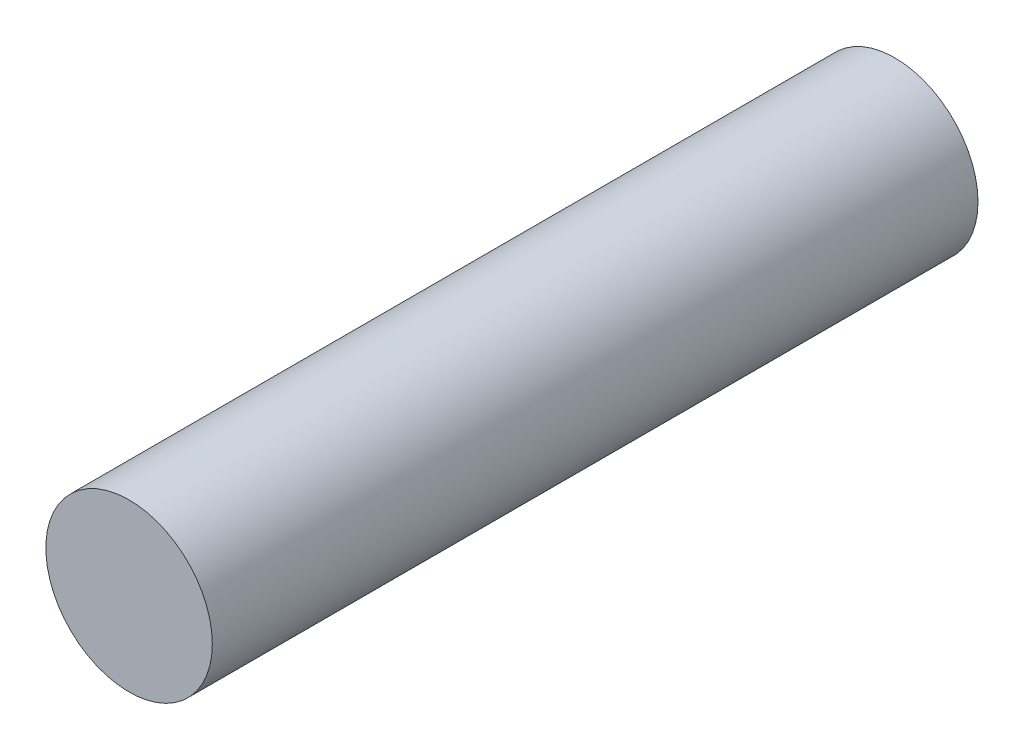
ISO-10303-21;
HEADER;
FILE_DESCRIPTION(('STEP AP214'),'2;1');
FILE_NAME('part.step','',(''),(''),'','','');
FILE_SCHEMA(('AUTOMOTIVE_DESIGN { 1 0 10303 214 1 1 1 1 }'));
ENDSEC;
DATA;
#1=APPLICATION_CONTEXT('core data for automotive mechanical design processes');
#2=APPLICATION_PROTOCOL_DEFINITION('international standard','automotive_design',2000,#1);
#3=PRODUCT_CONTEXT('',#1,'mechanical');
#4=PRODUCT('Part','Part','',(#3));
#5=PRODUCT_RELATED_PRODUCT_CATEGORY('part','',(#4));
#6=PRODUCT_DEFINITION_FORMATION('','',#4);
#7=PRODUCT_DEFINITION_CONTEXT('part definition',#1,'design');
#8=PRODUCT_DEFINITION('design','',#6,#7);
#9=PRODUCT_DEFINITION_SHAPE('','',#8);
#10=(LENGTH_UNIT() NAMED_UNIT(*) SI_UNIT(.MILLI.,.METRE.));
#11=(NAMED_UNIT(*) PLANE_ANGLE_UNIT() SI_UNIT($,.RADIAN.));
#12=(NAMED_UNIT(*) SI_UNIT($,.STERADIAN.) SOLID_ANGLE_UNIT());
#13=UNCERTAINTY_MEASURE_WITH_UNIT(LENGTH_MEASURE(1.E-05),#10,'distance_accuracy_value','');
#14=(GEOMETRIC_REPRESENTATION_CONTEXT(3) GLOBAL_UNCERTAINTY_ASSIGNED_CONTEXT((#13)) GLOBAL_UNIT_ASSIGNED_CONTEXT((#10,
#11,#12)) REPRESENTATION_CONTEXT('',''));
#15=CARTESIAN_POINT('',(0.,0.,0.));
#16=DIRECTION('',(0.,0.,1.));
#17=DIRECTION('',(1.,0.,0.));
#18=AXIS2_PLACEMENT_3D('',#15,#16,#17);
#19=CARTESIAN_POINT('',(0.,0.,23.));
#20=DIRECTION('',(0.,0.,-1.));
#21=DIRECTION('',(-1.,0.,0.));
#22=AXIS2_PLACEMENT_3D('',#19,#20,#21);
#23=CYLINDRICAL_SURFACE('',#22,2.5);
#24=CARTESIAN_POINT('',(0.,0.,23.));
#25=DIRECTION('',(0.,0.,1.));
#26=DIRECTION('',(1.,0.,0.));
#27=AXIS2_PLACEMENT_3D('',#24,#25,#26);
#28=CIRCLE('',#27,2.5);
#29=CARTESIAN_POINT('',(2.5,0.,23.));
#30=VERTEX_POINT('',#29);
#31=EDGE_CURVE('E10',#30,#30,#28,.T.);
#32=ORIENTED_EDGE('',*,*,#31,.F.);
#33=EDGE_LOOP('',(#32));
#34=FACE_BOUND('',#33,.T.);
#35=CARTESIAN_POINT('',(0.,0.,0.));
#36=DIRECTION('',(0.,0.,1.));
#37=DIRECTION('',(1.,0.,0.));
#38=AXIS2_PLACEMENT_3D('',#35,#36,#37);
#39=CIRCLE('',#38,2.5);
#40=CARTESIAN_POINT('',(2.5,0.,0.));
#41=VERTEX_POINT('',#40);
#42=EDGE_CURVE('E34',#41,#41,#39,.T.);
#43=ORIENTED_EDGE('',*,*,#42,.T.);
#44=EDGE_LOOP('',(#43));
#45=FACE_BOUND('',#44,.T.);
#46=ADVANCED_FACE('F31',(#34,#45),#23,.T.);
#47=CARTESIAN_POINT('',(0.,0.,23.));
#48=DIRECTION('',(0.,0.,1.));
#49=DIRECTION('',(1.,0.,0.));
#50=AXIS2_PLACEMENT_3D('',#47,#48,#49);
#51=PLANE('',#50);
#52=ORIENTED_EDGE('',*,*,#31,.T.);
#53=EDGE_LOOP('',(#52));
#54=FACE_BOUND('',#53,.T.);
#55=ADVANCED_FACE('F46',(#54),#51,.T.);
#56=CARTESIAN_POINT('',(0.,0.,0.));
#57=DIRECTION('',(0.,0.,1.));
#58=DIRECTION('',(1.,0.,0.));
#59=AXIS2_PLACEMENT_3D('',#56,#57,#58);
#60=PLANE('',#59);
#61=ORIENTED_EDGE('',*,*,#42,.F.);
#62=EDGE_LOOP('',(#61));
#63=FACE_BOUND('',#62,.T.);
#64=ADVANCED_FACE('F44',(#63),#60,.F.);
#65=CLOSED_SHELL('',(#46,#55,#64));
#66=MANIFOLD_SOLID_BREP('B2',#65);
#67=ADVANCED_BREP_SHAPE_REPRESENTATION('',(#18,#66),#14);
#68=SHAPE_DEFINITION_REPRESENTATION(#9,#67);
ENDSEC;
END-ISO-10303-21;
